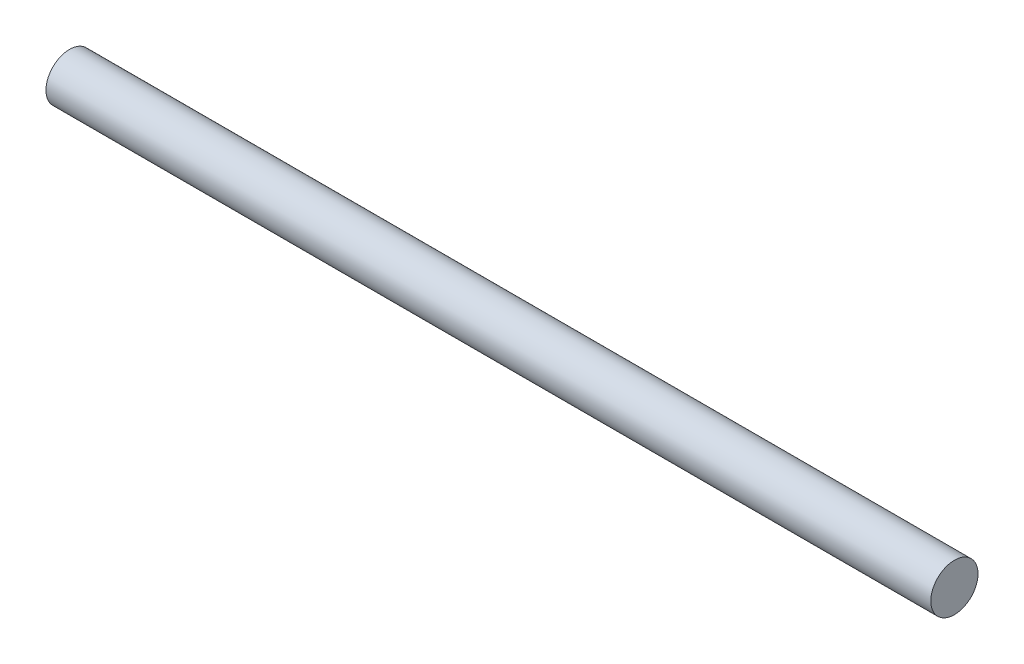
ISO-10303-21;
HEADER;
FILE_DESCRIPTION(('STEP AP214'),'2;1');
FILE_NAME('part.step','',(''),(''),'','','');
FILE_SCHEMA(('AUTOMOTIVE_DESIGN { 1 0 10303 214 1 1 1 1 }'));
ENDSEC;
DATA;
#1=APPLICATION_CONTEXT('core data for automotive mechanical design processes');
#2=APPLICATION_PROTOCOL_DEFINITION('international standard','automotive_design',2000,#1);
#3=PRODUCT_CONTEXT('',#1,'mechanical');
#4=PRODUCT('Part','Part','',(#3));
#5=PRODUCT_RELATED_PRODUCT_CATEGORY('part','',(#4));
#6=PRODUCT_DEFINITION_FORMATION('','',#4);
#7=PRODUCT_DEFINITION_CONTEXT('part definition',#1,'design');
#8=PRODUCT_DEFINITION('design','',#6,#7);
#9=PRODUCT_DEFINITION_SHAPE('','',#8);
#10=(LENGTH_UNIT() NAMED_UNIT(*) SI_UNIT(.MILLI.,.METRE.));
#11=(NAMED_UNIT(*) PLANE_ANGLE_UNIT() SI_UNIT($,.RADIAN.));
#12=(NAMED_UNIT(*) SI_UNIT($,.STERADIAN.) SOLID_ANGLE_UNIT());
#13=UNCERTAINTY_MEASURE_WITH_UNIT(LENGTH_MEASURE(1.E-05),#10,'distance_accuracy_value','');
#14=(GEOMETRIC_REPRESENTATION_CONTEXT(3) GLOBAL_UNCERTAINTY_ASSIGNED_CONTEXT((#13)) GLOBAL_UNIT_ASSIGNED_CONTEXT((#10,
#11,#12)) REPRESENTATION_CONTEXT('',''));
#15=CARTESIAN_POINT('',(0.,0.,0.));
#16=DIRECTION('',(0.,0.,1.));
#17=DIRECTION('',(1.,0.,0.));
#18=AXIS2_PLACEMENT_3D('',#15,#16,#17);
#19=CARTESIAN_POINT('',(150.,0.,0.));
#20=DIRECTION('',(-1.,0.,0.));
#21=DIRECTION('',(0.,0.,1.));
#22=AXIS2_PLACEMENT_3D('',#19,#20,#21);
#23=CYLINDRICAL_SURFACE('',#22,4.);
#24=CARTESIAN_POINT('',(150.,0.,0.));
#25=DIRECTION('',(1.,0.,0.));
#26=DIRECTION('',(0.,0.,-1.));
#27=AXIS2_PLACEMENT_3D('',#24,#25,#26);
#28=CIRCLE('',#27,4.);
#29=CARTESIAN_POINT('',(150.,0.,-4.));
#30=VERTEX_POINT('',#29);
#31=EDGE_CURVE('E10',#30,#30,#28,.T.);
#32=ORIENTED_EDGE('',*,*,#31,.F.);
#33=EDGE_LOOP('',(#32));
#34=FACE_BOUND('',#33,.T.);
#35=CARTESIAN_POINT('',(0.,0.,0.));
#36=DIRECTION('',(1.,0.,0.));
#37=DIRECTION('',(0.,0.,-1.));
#38=AXIS2_PLACEMENT_3D('',#35,#36,#37);
#39=CIRCLE('',#38,4.);
#40=CARTESIAN_POINT('',(0.,0.,-4.));
#41=VERTEX_POINT('',#40);
#42=EDGE_CURVE('E42',#41,#41,#39,.T.);
#43=ORIENTED_EDGE('',*,*,#42,.T.);
#44=EDGE_LOOP('',(#43));
#45=FACE_BOUND('',#44,.T.);
#46=ADVANCED_FACE('F39',(#34,#45),#23,.T.);
#47=CARTESIAN_POINT('',(150.,0.,0.));
#48=DIRECTION('',(1.,0.,0.));
#49=DIRECTION('',(0.,0.,-1.));
#50=AXIS2_PLACEMENT_3D('',#47,#48,#49);
#51=PLANE('',#50);
#52=ORIENTED_EDGE('',*,*,#31,.T.);
#53=EDGE_LOOP('',(#52));
#54=FACE_BOUND('',#53,.T.);
#55=ADVANCED_FACE('F56',(#54),#51,.T.);
#56=CARTESIAN_POINT('',(0.,0.,0.));
#57=DIRECTION('',(1.,0.,0.));
#58=DIRECTION('',(0.,0.,-1.));
#59=AXIS2_PLACEMENT_3D('',#56,#57,#58);
#60=PLANE('',#59);
#61=ORIENTED_EDGE('',*,*,#42,.F.);
#62=EDGE_LOOP('',(#61));
#63=FACE_BOUND('',#62,.T.);
#64=ADVANCED_FACE('F54',(#63),#60,.F.);
#65=CLOSED_SHELL('',(#46,#55,#64));
#66=MANIFOLD_SOLID_BREP('B2',#65);
#67=ADVANCED_BREP_SHAPE_REPRESENTATION('',(#18,#66),#14);
#68=SHAPE_DEFINITION_REPRESENTATION(#9,#67);
ENDSEC;
END-ISO-10303-21;
